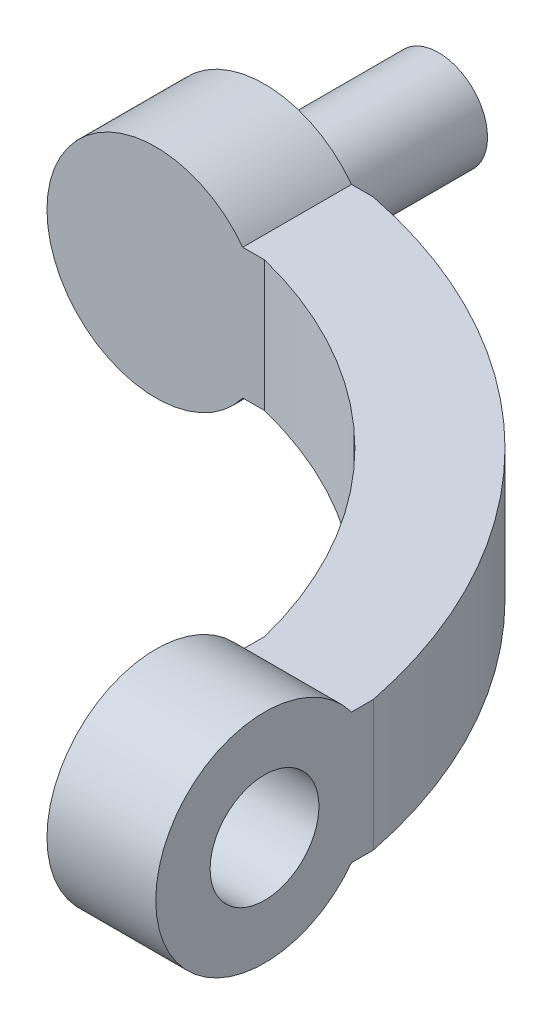
ISO-10303-21;
HEADER;
FILE_DESCRIPTION(('STEP AP214'),'2;1');
FILE_NAME('part.step','',(''),(''),'','','');
FILE_SCHEMA(('AUTOMOTIVE_DESIGN { 1 0 10303 214 1 1 1 1 }'));
ENDSEC;
DATA;
#1=APPLICATION_CONTEXT('core data for automotive mechanical design processes');
#2=APPLICATION_PROTOCOL_DEFINITION('international standard','automotive_design',2000,#1);
#3=PRODUCT_CONTEXT('',#1,'mechanical');
#4=PRODUCT('Part','Part','',(#3));
#5=PRODUCT_RELATED_PRODUCT_CATEGORY('part','',(#4));
#6=PRODUCT_DEFINITION_FORMATION('','',#4);
#7=PRODUCT_DEFINITION_CONTEXT('part definition',#1,'design');
#8=PRODUCT_DEFINITION('design','',#6,#7);
#9=PRODUCT_DEFINITION_SHAPE('','',#8);
#10=(LENGTH_UNIT() NAMED_UNIT(*) SI_UNIT(.MILLI.,.METRE.));
#11=(NAMED_UNIT(*) PLANE_ANGLE_UNIT() SI_UNIT($,.RADIAN.));
#12=(NAMED_UNIT(*) SI_UNIT($,.STERADIAN.) SOLID_ANGLE_UNIT());
#13=UNCERTAINTY_MEASURE_WITH_UNIT(LENGTH_MEASURE(1.E-05),#10,'distance_accuracy_value','');
#14=(GEOMETRIC_REPRESENTATION_CONTEXT(3) GLOBAL_UNCERTAINTY_ASSIGNED_CONTEXT((#13)) GLOBAL_UNIT_ASSIGNED_CONTEXT((#10,
#11,#12)) REPRESENTATION_CONTEXT('',''));
#15=CARTESIAN_POINT('',(0.,0.,0.));
#16=DIRECTION('',(0.,0.,1.));
#17=DIRECTION('',(1.,0.,0.));
#18=AXIS2_PLACEMENT_3D('',#15,#16,#17);
#19=CARTESIAN_POINT('',(0.,0.,5.));
#20=DIRECTION('',(0.,0.,-1.));
#21=DIRECTION('',(-1.,0.,0.));
#22=AXIS2_PLACEMENT_3D('',#19,#20,#21);
#23=CYLINDRICAL_SURFACE('',#22,5.);
#24=DIRECTION('',(0.,0.,-1.));
#25=VECTOR('',#24,1.);
#26=CARTESIAN_POINT('',(4.,-3.,5.));
#27=LINE('',#26,#25);
#28=CARTESIAN_POINT('',(4.,-3.,5.));
#29=VERTEX_POINT('',#28);
#30=CARTESIAN_POINT('',(4.,-3.,0.));
#31=VERTEX_POINT('',#30);
#32=EDGE_CURVE('E51',#29,#31,#27,.T.);
#33=ORIENTED_EDGE('',*,*,#32,.F.);
#34=CARTESIAN_POINT('',(0.,0.,5.));
#35=DIRECTION('',(0.,0.,1.));
#36=DIRECTION('',(1.,0.,0.));
#37=AXIS2_PLACEMENT_3D('',#34,#35,#36);
#38=CIRCLE('',#37,5.);
#39=CARTESIAN_POINT('',(4.,3.,5.));
#40=VERTEX_POINT('',#39);
#41=EDGE_CURVE('E11',#40,#29,#38,.T.);
#42=ORIENTED_EDGE('',*,*,#41,.F.);
#43=DIRECTION('',(0.,0.,-1.));
#44=VECTOR('',#43,1.);
#45=CARTESIAN_POINT('',(4.,3.,5.));
#46=LINE('',#45,#44);
#47=CARTESIAN_POINT('',(4.,3.,0.));
#48=VERTEX_POINT('',#47);
#49=EDGE_CURVE('E149',#48,#40,#46,.F.);
#50=ORIENTED_EDGE('',*,*,#49,.F.);
#51=CARTESIAN_POINT('',(0.,0.,0.));
#52=DIRECTION('',(0.,0.,1.));
#53=DIRECTION('',(1.,0.,0.));
#54=AXIS2_PLACEMENT_3D('',#51,#52,#53);
#55=CIRCLE('',#54,5.);
#56=EDGE_CURVE('E40',#48,#31,#55,.T.);
#57=ORIENTED_EDGE('',*,*,#56,.T.);
#58=EDGE_LOOP('',(#33,#42,#50,#57));
#59=FACE_BOUND('',#58,.T.);
#60=ADVANCED_FACE('F37',(#59),#23,.T.);
#61=CARTESIAN_POINT('',(0.,0.,5.));
#62=DIRECTION('',(0.,0.,1.));
#63=DIRECTION('',(1.,0.,0.));
#64=AXIS2_PLACEMENT_3D('',#61,#62,#63);
#65=PLANE('',#64);
#66=DIRECTION('',(1.,0.,0.));
#67=VECTOR('',#66,1.);
#68=CARTESIAN_POINT('',(2.,-3.,5.));
#69=LINE('',#68,#67);
#70=CARTESIAN_POINT('',(5.,-3.,5.));
#71=VERTEX_POINT('',#70);
#72=EDGE_CURVE('E146',#29,#71,#69,.T.);
#73=ORIENTED_EDGE('',*,*,#72,.T.);
#74=DIRECTION('',(0.,1.,0.));
#75=VECTOR('',#74,1.);
#76=CARTESIAN_POINT('',(5.,-3.,5.));
#77=LINE('',#76,#75);
#78=CARTESIAN_POINT('',(5.,3.,5.));
#79=VERTEX_POINT('',#78);
#80=EDGE_CURVE('E117',#71,#79,#77,.T.);
#81=ORIENTED_EDGE('',*,*,#80,.T.);
#82=DIRECTION('',(1.,0.,0.));
#83=VECTOR('',#82,1.);
#84=CARTESIAN_POINT('',(2.,3.,5.));
#85=LINE('',#84,#83);
#86=EDGE_CURVE('E143',#40,#79,#85,.T.);
#87=ORIENTED_EDGE('',*,*,#86,.F.);
#88=ORIENTED_EDGE('',*,*,#41,.T.);
#89=EDGE_LOOP('',(#73,#81,#87,#88));
#90=FACE_BOUND('',#89,.T.);
#91=ADVANCED_FACE('F198',(#90),#65,.T.);
#92=CARTESIAN_POINT('',(0.,0.,0.));
#93=DIRECTION('',(0.,0.,1.));
#94=DIRECTION('',(1.,0.,0.));
#95=AXIS2_PLACEMENT_3D('',#92,#93,#94);
#96=PLANE('',#95);
#97=CARTESIAN_POINT('',(0.,0.,0.));
#98=DIRECTION('',(0.,0.,1.));
#99=DIRECTION('',(1.,0.,0.));
#100=AXIS2_PLACEMENT_3D('',#97,#98,#99);
#101=CIRCLE('',#100,2.25);
#102=CARTESIAN_POINT('',(2.25,0.,0.));
#103=VERTEX_POINT('',#102);
#104=EDGE_CURVE('E180',#103,#103,#101,.T.);
#105=ORIENTED_EDGE('',*,*,#104,.T.);
#106=EDGE_LOOP('',(#105));
#107=FACE_BOUND('',#106,.T.);
#108=ORIENTED_EDGE('',*,*,#56,.F.);
#109=DIRECTION('',(1.,0.,0.));
#110=VECTOR('',#109,1.);
#111=CARTESIAN_POINT('',(2.,3.,0.));
#112=LINE('',#111,#110);
#113=CARTESIAN_POINT('',(5.,3.,0.));
#114=VERTEX_POINT('',#113);
#115=EDGE_CURVE('E140',#48,#114,#112,.T.);
#116=ORIENTED_EDGE('',*,*,#115,.T.);
#117=DIRECTION('',(0.,-1.,0.));
#118=VECTOR('',#117,1.);
#119=CARTESIAN_POINT('',(5.,3.,0.));
#120=LINE('',#119,#118);
#121=CARTESIAN_POINT('',(5.,-3.,0.));
#122=VERTEX_POINT('',#121);
#123=EDGE_CURVE('E137',#114,#122,#120,.T.);
#124=ORIENTED_EDGE('',*,*,#123,.T.);
#125=DIRECTION('',(1.,0.,0.));
#126=VECTOR('',#125,1.);
#127=CARTESIAN_POINT('',(2.,-3.,0.));
#128=LINE('',#127,#126);
#129=EDGE_CURVE('E124',#31,#122,#128,.T.);
#130=ORIENTED_EDGE('',*,*,#129,.F.);
#131=EDGE_LOOP('',(#108,#116,#124,#130));
#132=FACE_BOUND('',#131,.T.);
#133=ADVANCED_FACE('F154',(#107,#132),#96,.F.);
#134=CARTESIAN_POINT('',(2.,-3.,0.));
#135=DIRECTION('',(0.,1.,0.));
#136=DIRECTION('',(0.,0.,1.));
#137=AXIS2_PLACEMENT_3D('',#134,#135,#136);
#138=PLANE('',#137);
#139=ORIENTED_EDGE('',*,*,#72,.F.);
#140=ORIENTED_EDGE('',*,*,#32,.T.);
#141=ORIENTED_EDGE('',*,*,#129,.T.);
#142=CARTESIAN_POINT('',(0.,-3.,25.));
#143=DIRECTION('',(0.,1.,0.));
#144=DIRECTION('',(0.,0.,1.));
#145=AXIS2_PLACEMENT_3D('',#142,#143,#144);
#146=CIRCLE('',#145,25.4950975679639);
#147=CARTESIAN_POINT('',(25.,-3.,20.));
#148=VERTEX_POINT('',#147);
#149=EDGE_CURVE('E114',#122,#148,#146,.F.);
#150=ORIENTED_EDGE('',*,*,#149,.T.);
#151=DIRECTION('',(0.,0.,-1.));
#152=VECTOR('',#151,1.);
#153=CARTESIAN_POINT('',(25.,-3.,23.));
#154=LINE('',#153,#152);
#155=CARTESIAN_POINT('',(25.,-3.,21.));
#156=VERTEX_POINT('',#155);
#157=EDGE_CURVE('E96',#156,#148,#154,.T.);
#158=ORIENTED_EDGE('',*,*,#157,.F.);
#159=DIRECTION('',(-1.,0.,0.));
#160=VECTOR('',#159,1.);
#161=CARTESIAN_POINT('',(0.,-3.,21.));
#162=LINE('',#161,#160);
#163=CARTESIAN_POINT('',(20.0000000000001,-3.,21.));
#164=VERTEX_POINT('',#163);
#165=EDGE_CURVE('E108',#156,#164,#162,.T.);
#166=ORIENTED_EDGE('',*,*,#165,.T.);
#167=DIRECTION('',(0.,0.,-1.));
#168=VECTOR('',#167,1.);
#169=CARTESIAN_POINT('',(20.0000000000001,-3.,23.));
#170=LINE('',#169,#168);
#171=CARTESIAN_POINT('',(20.,-3.,20.));
#172=VERTEX_POINT('',#171);
#173=EDGE_CURVE('E107',#164,#172,#170,.T.);
#174=ORIENTED_EDGE('',*,*,#173,.T.);
#175=CARTESIAN_POINT('',(0.,-3.,25.));
#176=DIRECTION('',(0.,1.,0.));
#177=DIRECTION('',(0.,0.,1.));
#178=AXIS2_PLACEMENT_3D('',#175,#176,#177);
#179=CIRCLE('',#178,20.6155281280883);
#180=EDGE_CURVE('E125',#71,#172,#179,.F.);
#181=ORIENTED_EDGE('',*,*,#180,.F.);
#182=EDGE_LOOP('',(#139,#140,#141,#150,#158,#166,#174,#181));
#183=FACE_BOUND('',#182,.T.);
#184=ADVANCED_FACE('F122',(#183),#138,.F.);
#185=CARTESIAN_POINT('',(2.,3.,5.));
#186=DIRECTION('',(0.,-1.,0.));
#187=DIRECTION('',(0.,0.,-1.));
#188=AXIS2_PLACEMENT_3D('',#185,#186,#187);
#189=PLANE('',#188);
#190=ORIENTED_EDGE('',*,*,#115,.F.);
#191=ORIENTED_EDGE('',*,*,#49,.T.);
#192=ORIENTED_EDGE('',*,*,#86,.T.);
#193=CARTESIAN_POINT('',(0.,3.,25.));
#194=DIRECTION('',(0.,1.,0.));
#195=DIRECTION('',(0.,0.,1.));
#196=AXIS2_PLACEMENT_3D('',#193,#194,#195);
#197=CIRCLE('',#196,20.6155281280883);
#198=CARTESIAN_POINT('',(20.,3.,20.));
#199=VERTEX_POINT('',#198);
#200=EDGE_CURVE('E126',#79,#199,#197,.F.);
#201=ORIENTED_EDGE('',*,*,#200,.T.);
#202=DIRECTION('',(0.,0.,-1.));
#203=VECTOR('',#202,1.);
#204=CARTESIAN_POINT('',(20.0000000000001,3.,23.));
#205=LINE('',#204,#203);
#206=CARTESIAN_POINT('',(20.0000000000001,3.,21.));
#207=VERTEX_POINT('',#206);
#208=EDGE_CURVE('E159',#207,#199,#205,.T.);
#209=ORIENTED_EDGE('',*,*,#208,.F.);
#210=DIRECTION('',(-1.,0.,0.));
#211=VECTOR('',#210,1.);
#212=CARTESIAN_POINT('',(0.,3.,21.));
#213=LINE('',#212,#211);
#214=CARTESIAN_POINT('',(25.,3.,21.));
#215=VERTEX_POINT('',#214);
#216=EDGE_CURVE('E166',#215,#207,#213,.T.);
#217=ORIENTED_EDGE('',*,*,#216,.F.);
#218=DIRECTION('',(0.,0.,-1.));
#219=VECTOR('',#218,1.);
#220=CARTESIAN_POINT('',(25.,3.,23.));
#221=LINE('',#220,#219);
#222=CARTESIAN_POINT('',(25.,3.,20.));
#223=VERTEX_POINT('',#222);
#224=EDGE_CURVE('E158',#215,#223,#221,.T.);
#225=ORIENTED_EDGE('',*,*,#224,.T.);
#226=CARTESIAN_POINT('',(0.,3.,25.));
#227=DIRECTION('',(0.,1.,0.));
#228=DIRECTION('',(0.,0.,1.));
#229=AXIS2_PLACEMENT_3D('',#226,#227,#228);
#230=CIRCLE('',#229,25.4950975679639);
#231=EDGE_CURVE('E116',#114,#223,#230,.F.);
#232=ORIENTED_EDGE('',*,*,#231,.F.);
#233=EDGE_LOOP('',(#190,#191,#192,#201,#209,#217,#225,#232));
#234=FACE_BOUND('',#233,.T.);
#235=ADVANCED_FACE('F156',(#234),#189,.F.);
#236=CARTESIAN_POINT('',(0.,-3.,25.));
#237=DIRECTION('',(0.,1.,0.));
#238=DIRECTION('',(0.,0.,1.));
#239=AXIS2_PLACEMENT_3D('',#236,#237,#238);
#240=CYLINDRICAL_SURFACE('',#239,25.4950975679639);
#241=ORIENTED_EDGE('',*,*,#123,.F.);
#242=ORIENTED_EDGE('',*,*,#231,.T.);
#243=DIRECTION('',(0.,1.,0.));
#244=VECTOR('',#243,1.);
#245=CARTESIAN_POINT('',(25.,-3.,20.));
#246=LINE('',#245,#244);
#247=EDGE_CURVE('E100',#148,#223,#246,.T.);
#248=ORIENTED_EDGE('',*,*,#247,.F.);
#249=ORIENTED_EDGE('',*,*,#149,.F.);
#250=EDGE_LOOP('',(#241,#242,#248,#249));
#251=FACE_BOUND('',#250,.T.);
#252=ADVANCED_FACE('F113',(#251),#240,.T.);
#253=CARTESIAN_POINT('',(0.,-3.,25.));
#254=DIRECTION('',(0.,1.,0.));
#255=DIRECTION('',(0.,0.,1.));
#256=AXIS2_PLACEMENT_3D('',#253,#254,#255);
#257=CYLINDRICAL_SURFACE('',#256,20.6155281280883);
#258=DIRECTION('',(0.,1.,0.));
#259=VECTOR('',#258,1.);
#260=CARTESIAN_POINT('',(20.,-3.,20.));
#261=LINE('',#260,#259);
#262=EDGE_CURVE('E118',#172,#199,#261,.T.);
#263=ORIENTED_EDGE('',*,*,#262,.T.);
#264=ORIENTED_EDGE('',*,*,#200,.F.);
#265=ORIENTED_EDGE('',*,*,#80,.F.);
#266=ORIENTED_EDGE('',*,*,#180,.T.);
#267=EDGE_LOOP('',(#263,#264,#265,#266));
#268=FACE_BOUND('',#267,.T.);
#269=ADVANCED_FACE('F215',(#268),#257,.F.);
#270=CARTESIAN_POINT('',(25.,-3.,23.));
#271=DIRECTION('',(-1.,0.,0.));
#272=DIRECTION('',(0.,0.,1.));
#273=AXIS2_PLACEMENT_3D('',#270,#271,#272);
#274=PLANE('',#273);
#275=CARTESIAN_POINT('',(25.0000000000001,0.,25.));
#276=DIRECTION('',(-1.,0.,0.));
#277=DIRECTION('',(0.,0.,1.));
#278=AXIS2_PLACEMENT_3D('',#275,#276,#277);
#279=CIRCLE('',#278,2.5);
#280=CARTESIAN_POINT('',(25.0000000000001,0.,27.5));
#281=VERTEX_POINT('',#280);
#282=EDGE_CURVE('E173',#281,#281,#279,.T.);
#283=ORIENTED_EDGE('',*,*,#282,.T.);
#284=EDGE_LOOP('',(#283));
#285=FACE_BOUND('',#284,.T.);
#286=CARTESIAN_POINT('',(25.,0.,25.));
#287=DIRECTION('',(-1.,0.,0.));
#288=DIRECTION('',(0.,0.,1.));
#289=AXIS2_PLACEMENT_3D('',#286,#287,#288);
#290=CIRCLE('',#289,5.);
#291=EDGE_CURVE('E103',#156,#215,#290,.T.);
#292=ORIENTED_EDGE('',*,*,#291,.F.);
#293=ORIENTED_EDGE('',*,*,#157,.T.);
#294=ORIENTED_EDGE('',*,*,#247,.T.);
#295=ORIENTED_EDGE('',*,*,#224,.F.);
#296=EDGE_LOOP('',(#292,#293,#294,#295));
#297=FACE_BOUND('',#296,.T.);
#298=ADVANCED_FACE('F98',(#285,#297),#274,.F.);
#299=CARTESIAN_POINT('',(20.0000000000001,3.,23.));
#300=DIRECTION('',(1.,0.,0.));
#301=DIRECTION('',(0.,0.,-1.));
#302=AXIS2_PLACEMENT_3D('',#299,#300,#301);
#303=PLANE('',#302);
#304=CARTESIAN_POINT('',(20.0000000000001,0.,25.));
#305=DIRECTION('',(-1.,0.,0.));
#306=DIRECTION('',(0.,0.,1.));
#307=AXIS2_PLACEMENT_3D('',#304,#305,#306);
#308=CIRCLE('',#307,2.5);
#309=CARTESIAN_POINT('',(20.0000000000001,0.,27.5));
#310=VERTEX_POINT('',#309);
#311=EDGE_CURVE('E174',#310,#310,#308,.T.);
#312=ORIENTED_EDGE('',*,*,#311,.F.);
#313=EDGE_LOOP('',(#312));
#314=FACE_BOUND('',#313,.T.);
#315=ORIENTED_EDGE('',*,*,#173,.F.);
#316=CARTESIAN_POINT('',(20.,0.,25.));
#317=DIRECTION('',(-1.,0.,0.));
#318=DIRECTION('',(0.,0.,1.));
#319=AXIS2_PLACEMENT_3D('',#316,#317,#318);
#320=CIRCLE('',#319,5.);
#321=EDGE_CURVE('E170',#164,#207,#320,.T.);
#322=ORIENTED_EDGE('',*,*,#321,.T.);
#323=ORIENTED_EDGE('',*,*,#208,.T.);
#324=ORIENTED_EDGE('',*,*,#262,.F.);
#325=EDGE_LOOP('',(#315,#322,#323,#324));
#326=FACE_BOUND('',#325,.T.);
#327=ADVANCED_FACE('F221',(#314,#326),#303,.F.);
#328=CARTESIAN_POINT('',(0.,0.,25.));
#329=DIRECTION('',(-1.,0.,0.));
#330=DIRECTION('',(0.,0.,1.));
#331=AXIS2_PLACEMENT_3D('',#328,#329,#330);
#332=CYLINDRICAL_SURFACE('',#331,5.);
#333=ORIENTED_EDGE('',*,*,#165,.F.);
#334=ORIENTED_EDGE('',*,*,#291,.T.);
#335=ORIENTED_EDGE('',*,*,#216,.T.);
#336=ORIENTED_EDGE('',*,*,#321,.F.);
#337=EDGE_LOOP('',(#333,#334,#335,#336));
#338=FACE_BOUND('',#337,.T.);
#339=ADVANCED_FACE('F225',(#338),#332,.T.);
#340=CARTESIAN_POINT('',(25.0000000000001,0.,25.));
#341=DIRECTION('',(-1.,0.,0.));
#342=DIRECTION('',(0.,0.,1.));
#343=AXIS2_PLACEMENT_3D('',#340,#341,#342);
#344=CYLINDRICAL_SURFACE('',#343,2.5);
#345=ORIENTED_EDGE('',*,*,#282,.F.);
#346=EDGE_LOOP('',(#345));
#347=FACE_BOUND('',#346,.T.);
#348=ORIENTED_EDGE('',*,*,#311,.T.);
#349=EDGE_LOOP('',(#348));
#350=FACE_BOUND('',#349,.T.);
#351=ADVANCED_FACE('F195',(#347,#350),#344,.F.);
#352=CARTESIAN_POINT('',(0.,0.,-8.));
#353=DIRECTION('',(0.,0.,1.));
#354=DIRECTION('',(1.,0.,0.));
#355=AXIS2_PLACEMENT_3D('',#352,#353,#354);
#356=CYLINDRICAL_SURFACE('',#355,2.25);
#357=CARTESIAN_POINT('',(0.,0.,-8.));
#358=DIRECTION('',(0.,0.,1.));
#359=DIRECTION('',(1.,0.,0.));
#360=AXIS2_PLACEMENT_3D('',#357,#358,#359);
#361=CIRCLE('',#360,2.25);
#362=CARTESIAN_POINT('',(2.25,0.,-8.));
#363=VERTEX_POINT('',#362);
#364=EDGE_CURVE('E177',#363,#363,#361,.T.);
#365=ORIENTED_EDGE('',*,*,#364,.T.);
#366=EDGE_LOOP('',(#365));
#367=FACE_BOUND('',#366,.T.);
#368=ORIENTED_EDGE('',*,*,#104,.F.);
#369=EDGE_LOOP('',(#368));
#370=FACE_BOUND('',#369,.T.);
#371=ADVANCED_FACE('F186',(#367,#370),#356,.T.);
#372=CARTESIAN_POINT('',(0.,0.,-8.));
#373=DIRECTION('',(0.,0.,1.));
#374=DIRECTION('',(1.,0.,0.));
#375=AXIS2_PLACEMENT_3D('',#372,#373,#374);
#376=PLANE('',#375);
#377=ORIENTED_EDGE('',*,*,#364,.F.);
#378=EDGE_LOOP('',(#377));
#379=FACE_BOUND('',#378,.T.);
#380=ADVANCED_FACE('F189',(#379),#376,.F.);
#381=CLOSED_SHELL('',(#60,#91,#133,#184,#235,#252,#269,#298,#327,#339,#351,#371,#380));
#382=MANIFOLD_SOLID_BREP('B2',#381);
#383=ADVANCED_BREP_SHAPE_REPRESENTATION('',(#18,#382),#14);
#384=SHAPE_DEFINITION_REPRESENTATION(#9,#383);
ENDSEC;
END-ISO-10303-21;
